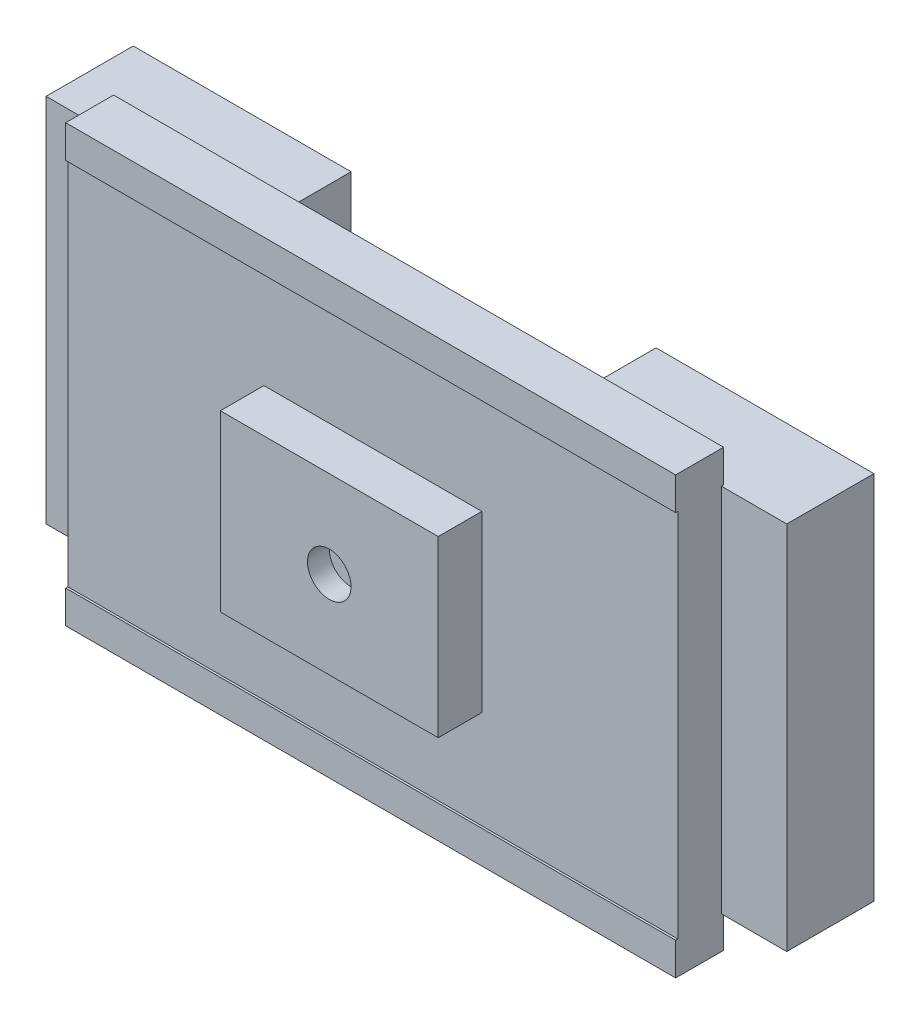
ISO-10303-21;
HEADER;
FILE_DESCRIPTION(('STEP AP214'),'2;1');
FILE_NAME('part.step','',(''),(''),'','','');
FILE_SCHEMA(('AUTOMOTIVE_DESIGN { 1 0 10303 214 1 1 1 1 }'));
ENDSEC;
DATA;
#1=APPLICATION_CONTEXT('core data for automotive mechanical design processes');
#2=APPLICATION_PROTOCOL_DEFINITION('international standard','automotive_design',2000,#1);
#3=PRODUCT_CONTEXT('',#1,'mechanical');
#4=PRODUCT('Part','Part','',(#3));
#5=PRODUCT_RELATED_PRODUCT_CATEGORY('part','',(#4));
#6=PRODUCT_DEFINITION_FORMATION('','',#4);
#7=PRODUCT_DEFINITION_CONTEXT('part definition',#1,'design');
#8=PRODUCT_DEFINITION('design','',#6,#7);
#9=PRODUCT_DEFINITION_SHAPE('','',#8);
#10=(LENGTH_UNIT() NAMED_UNIT(*) SI_UNIT(.MILLI.,.METRE.));
#11=(NAMED_UNIT(*) PLANE_ANGLE_UNIT() SI_UNIT($,.RADIAN.));
#12=(NAMED_UNIT(*) SI_UNIT($,.STERADIAN.) SOLID_ANGLE_UNIT());
#13=UNCERTAINTY_MEASURE_WITH_UNIT(LENGTH_MEASURE(1.E-05),#10,'distance_accuracy_value','');
#14=(GEOMETRIC_REPRESENTATION_CONTEXT(3) GLOBAL_UNCERTAINTY_ASSIGNED_CONTEXT((#13)) GLOBAL_UNIT_ASSIGNED_CONTEXT((#10,
#11,#12)) REPRESENTATION_CONTEXT('',''));
#15=CARTESIAN_POINT('',(0.,0.,0.));
#16=DIRECTION('',(0.,0.,1.));
#17=DIRECTION('',(1.,0.,0.));
#18=AXIS2_PLACEMENT_3D('',#15,#16,#17);
#19=CARTESIAN_POINT('',(0.,0.,0.));
#20=DIRECTION('',(0.,0.,1.));
#21=DIRECTION('',(1.,0.,0.));
#22=AXIS2_PLACEMENT_3D('',#19,#20,#21);
#23=PLANE('',#22);
#24=DIRECTION('',(0.,1.,0.));
#25=VECTOR('',#24,1.);
#26=CARTESIAN_POINT('',(3.5,4.25,0.));
#27=LINE('',#26,#25);
#28=CARTESIAN_POINT('',(3.5,-4.25,0.));
#29=VERTEX_POINT('',#28);
#30=CARTESIAN_POINT('',(3.5,4.25,0.));
#31=VERTEX_POINT('',#30);
#32=EDGE_CURVE('E360',#29,#31,#27,.T.);
#33=ORIENTED_EDGE('',*,*,#32,.F.);
#34=DIRECTION('',(-1.,0.,0.));
#35=VECTOR('',#34,1.);
#36=CARTESIAN_POINT('',(0.,-4.25,0.));
#37=LINE('',#36,#35);
#38=CARTESIAN_POINT('',(-3.5,-4.25,0.));
#39=VERTEX_POINT('',#38);
#40=EDGE_CURVE('E277',#29,#39,#37,.T.);
#41=ORIENTED_EDGE('',*,*,#40,.T.);
#42=DIRECTION('',(0.,-1.,0.));
#43=VECTOR('',#42,1.);
#44=CARTESIAN_POINT('',(-3.5,4.25,0.));
#45=LINE('',#44,#43);
#46=CARTESIAN_POINT('',(-3.5,4.25,0.));
#47=VERTEX_POINT('',#46);
#48=EDGE_CURVE('E421',#47,#39,#45,.T.);
#49=ORIENTED_EDGE('',*,*,#48,.F.);
#50=DIRECTION('',(1.,0.,0.));
#51=VECTOR('',#50,1.);
#52=CARTESIAN_POINT('',(0.,4.25,0.));
#53=LINE('',#52,#51);
#54=EDGE_CURVE('E336',#47,#31,#53,.T.);
#55=ORIENTED_EDGE('',*,*,#54,.T.);
#56=EDGE_LOOP('',(#33,#41,#49,#55));
#57=FACE_BOUND('',#56,.T.);
#58=ADVANCED_FACE('F49',(#57),#23,.F.);
#59=CARTESIAN_POINT('',(0.,0.,1.));
#60=DIRECTION('',(0.,0.,1.));
#61=DIRECTION('',(1.,0.,0.));
#62=AXIS2_PLACEMENT_3D('',#59,#60,#61);
#63=PLANE('',#62);
#64=DIRECTION('',(-1.,0.,0.));
#65=VECTOR('',#64,1.);
#66=CARTESIAN_POINT('',(0.,-4.25,1.));
#67=LINE('',#66,#65);
#68=CARTESIAN_POINT('',(7.,-4.25,1.));
#69=VERTEX_POINT('',#68);
#70=CARTESIAN_POINT('',(-7.,-4.25,1.));
#71=VERTEX_POINT('',#70);
#72=EDGE_CURVE('E65',#69,#71,#67,.T.);
#73=ORIENTED_EDGE('',*,*,#72,.F.);
#74=DIRECTION('',(0.,1.,0.));
#75=VECTOR('',#74,1.);
#76=CARTESIAN_POINT('',(7.,5.,1.));
#77=LINE('',#76,#75);
#78=CARTESIAN_POINT('',(7.,4.25,1.));
#79=VERTEX_POINT('',#78);
#80=EDGE_CURVE('E485',#69,#79,#77,.T.);
#81=ORIENTED_EDGE('',*,*,#80,.T.);
#82=DIRECTION('',(1.,0.,0.));
#83=VECTOR('',#82,1.);
#84=CARTESIAN_POINT('',(0.,4.25,1.));
#85=LINE('',#84,#83);
#86=CARTESIAN_POINT('',(-7.,4.25,1.));
#87=VERTEX_POINT('',#86);
#88=EDGE_CURVE('E340',#87,#79,#85,.T.);
#89=ORIENTED_EDGE('',*,*,#88,.F.);
#90=DIRECTION('',(0.,-1.,0.));
#91=VECTOR('',#90,1.);
#92=CARTESIAN_POINT('',(-7.,5.,1.));
#93=LINE('',#92,#91);
#94=EDGE_CURVE('E70',#87,#71,#93,.T.);
#95=ORIENTED_EDGE('',*,*,#94,.T.);
#96=EDGE_LOOP('',(#73,#81,#89,#95));
#97=FACE_BOUND('',#96,.T.);
#98=DIRECTION('',(1.,0.,0.));
#99=VECTOR('',#98,1.);
#100=CARTESIAN_POINT('',(0.,2.,1.));
#101=LINE('',#100,#99);
#102=CARTESIAN_POINT('',(-2.5,2.,1.));
#103=VERTEX_POINT('',#102);
#104=CARTESIAN_POINT('',(2.5,2.,1.));
#105=VERTEX_POINT('',#104);
#106=EDGE_CURVE('E461',#103,#105,#101,.T.);
#107=ORIENTED_EDGE('',*,*,#106,.T.);
#108=DIRECTION('',(0.,-1.,0.));
#109=VECTOR('',#108,1.);
#110=CARTESIAN_POINT('',(2.5,0.,1.));
#111=LINE('',#110,#109);
#112=CARTESIAN_POINT('',(2.5,-2.,1.));
#113=VERTEX_POINT('',#112);
#114=EDGE_CURVE('E442',#105,#113,#111,.T.);
#115=ORIENTED_EDGE('',*,*,#114,.T.);
#116=DIRECTION('',(1.,0.,0.));
#117=VECTOR('',#116,1.);
#118=CARTESIAN_POINT('',(0.,-2.,1.));
#119=LINE('',#118,#117);
#120=CARTESIAN_POINT('',(-2.5,-2.,1.));
#121=VERTEX_POINT('',#120);
#122=EDGE_CURVE('E448',#121,#113,#119,.T.);
#123=ORIENTED_EDGE('',*,*,#122,.F.);
#124=DIRECTION('',(0.,-1.,0.));
#125=VECTOR('',#124,1.);
#126=CARTESIAN_POINT('',(-2.5,0.,1.));
#127=LINE('',#126,#125);
#128=EDGE_CURVE('E465',#103,#121,#127,.T.);
#129=ORIENTED_EDGE('',*,*,#128,.F.);
#130=EDGE_LOOP('',(#107,#115,#123,#129));
#131=FACE_BOUND('',#130,.T.);
#132=ADVANCED_FACE('F762',(#97,#131),#63,.T.);
#133=CARTESIAN_POINT('',(7.,5.,1.));
#134=DIRECTION('',(-1.,0.,0.));
#135=DIRECTION('',(0.,0.,1.));
#136=AXIS2_PLACEMENT_3D('',#133,#134,#135);
#137=PLANE('',#136);
#138=ORIENTED_EDGE('',*,*,#80,.F.);
#139=DIRECTION('',(0.,0.,-1.));
#140=VECTOR('',#139,1.);
#141=CARTESIAN_POINT('',(6.99999999999999,-4.25,1.05));
#142=LINE('',#141,#140);
#143=CARTESIAN_POINT('',(6.99999999999999,-4.25,1.05));
#144=VERTEX_POINT('',#143);
#145=EDGE_CURVE('E273',#144,#69,#142,.T.);
#146=ORIENTED_EDGE('',*,*,#145,.F.);
#147=DIRECTION('',(0.,-1.,0.));
#148=VECTOR('',#147,1.);
#149=CARTESIAN_POINT('',(6.99999999999999,-5.,1.05));
#150=LINE('',#149,#148);
#151=CARTESIAN_POINT('',(6.99999999999999,-5.,1.05));
#152=VERTEX_POINT('',#151);
#153=EDGE_CURVE('E269',#144,#152,#150,.T.);
#154=ORIENTED_EDGE('',*,*,#153,.T.);
#155=DIRECTION('',(0.,0.,-1.));
#156=VECTOR('',#155,1.);
#157=CARTESIAN_POINT('',(7.,-5.,1.));
#158=LINE('',#157,#156);
#159=CARTESIAN_POINT('',(6.99999999999999,-5.,-0.05));
#160=VERTEX_POINT('',#159);
#161=EDGE_CURVE('E231',#152,#160,#158,.T.);
#162=ORIENTED_EDGE('',*,*,#161,.T.);
#163=DIRECTION('',(0.,-1.,0.));
#164=VECTOR('',#163,1.);
#165=CARTESIAN_POINT('',(6.99999999999999,-5.,-0.05));
#166=LINE('',#165,#164);
#167=CARTESIAN_POINT('',(6.99999999999999,-4.25,-0.05));
#168=VERTEX_POINT('',#167);
#169=EDGE_CURVE('E247',#168,#160,#166,.T.);
#170=ORIENTED_EDGE('',*,*,#169,.F.);
#171=CARTESIAN_POINT('',(6.99999999999999,-4.25,0.));
#172=VERTEX_POINT('',#171);
#173=EDGE_CURVE('E278',#172,#168,#142,.T.);
#174=ORIENTED_EDGE('',*,*,#173,.F.);
#175=DIRECTION('',(0.,1.,0.));
#176=VECTOR('',#175,1.);
#177=CARTESIAN_POINT('',(7.,5.,0.));
#178=LINE('',#177,#176);
#179=CARTESIAN_POINT('',(7.,4.25,0.));
#180=VERTEX_POINT('',#179);
#181=EDGE_CURVE('E484',#172,#180,#178,.T.);
#182=ORIENTED_EDGE('',*,*,#181,.T.);
#183=DIRECTION('',(0.,0.,-1.));
#184=VECTOR('',#183,1.);
#185=CARTESIAN_POINT('',(7.,4.25,1.05));
#186=LINE('',#185,#184);
#187=CARTESIAN_POINT('',(7.,4.25,-0.0499999999999999));
#188=VERTEX_POINT('',#187);
#189=EDGE_CURVE('E325',#180,#188,#186,.T.);
#190=ORIENTED_EDGE('',*,*,#189,.T.);
#191=DIRECTION('',(0.,-1.,0.));
#192=VECTOR('',#191,1.);
#193=CARTESIAN_POINT('',(7.,5.,-0.05));
#194=LINE('',#193,#192);
#195=CARTESIAN_POINT('',(7.,5.,-0.05));
#196=VERTEX_POINT('',#195);
#197=EDGE_CURVE('E300',#196,#188,#194,.T.);
#198=ORIENTED_EDGE('',*,*,#197,.F.);
#199=DIRECTION('',(0.,0.,-1.));
#200=VECTOR('',#199,1.);
#201=CARTESIAN_POINT('',(7.,5.,1.));
#202=LINE('',#201,#200);
#203=CARTESIAN_POINT('',(7.,5.,1.05));
#204=VERTEX_POINT('',#203);
#205=EDGE_CURVE('E11',#204,#196,#202,.T.);
#206=ORIENTED_EDGE('',*,*,#205,.F.);
#207=DIRECTION('',(0.,-1.,0.));
#208=VECTOR('',#207,1.);
#209=CARTESIAN_POINT('',(7.,5.,1.05));
#210=LINE('',#209,#208);
#211=CARTESIAN_POINT('',(7.,4.25,1.05));
#212=VERTEX_POINT('',#211);
#213=EDGE_CURVE('E318',#204,#212,#210,.T.);
#214=ORIENTED_EDGE('',*,*,#213,.T.);
#215=EDGE_CURVE('E332',#212,#79,#186,.T.);
#216=ORIENTED_EDGE('',*,*,#215,.T.);
#217=EDGE_LOOP('',(#138,#146,#154,#162,#170,#174,#182,#190,#198,#206,#214,#216));
#218=FACE_BOUND('',#217,.T.);
#219=ADVANCED_FACE('F51',(#218),#137,.F.);
#220=CARTESIAN_POINT('',(-7.,5.,1.));
#221=DIRECTION('',(0.,-1.,0.));
#222=DIRECTION('',(0.,0.,-1.));
#223=AXIS2_PLACEMENT_3D('',#220,#221,#222);
#224=PLANE('',#223);
#225=ORIENTED_EDGE('',*,*,#205,.T.);
#226=DIRECTION('',(1.,0.,0.));
#227=VECTOR('',#226,1.);
#228=CARTESIAN_POINT('',(7.,5.,-0.05));
#229=LINE('',#228,#227);
#230=CARTESIAN_POINT('',(-7.,5.,-0.05));
#231=VERTEX_POINT('',#230);
#232=EDGE_CURVE('E296',#231,#196,#229,.T.);
#233=ORIENTED_EDGE('',*,*,#232,.F.);
#234=DIRECTION('',(0.,0.,-1.));
#235=VECTOR('',#234,1.);
#236=CARTESIAN_POINT('',(-7.,5.,1.));
#237=LINE('',#236,#235);
#238=CARTESIAN_POINT('',(-7.,5.,1.05));
#239=VERTEX_POINT('',#238);
#240=EDGE_CURVE('E58',#239,#231,#237,.T.);
#241=ORIENTED_EDGE('',*,*,#240,.F.);
#242=DIRECTION('',(1.,0.,0.));
#243=VECTOR('',#242,1.);
#244=CARTESIAN_POINT('',(7.,5.,1.05));
#245=LINE('',#244,#243);
#246=EDGE_CURVE('E314',#239,#204,#245,.T.);
#247=ORIENTED_EDGE('',*,*,#246,.T.);
#248=EDGE_LOOP('',(#225,#233,#241,#247));
#249=FACE_BOUND('',#248,.T.);
#250=ADVANCED_FACE('F506',(#249),#224,.F.);
#251=CARTESIAN_POINT('',(-7.,5.,1.));
#252=DIRECTION('',(1.,0.,0.));
#253=DIRECTION('',(0.,0.,-1.));
#254=AXIS2_PLACEMENT_3D('',#251,#252,#253);
#255=PLANE('',#254);
#256=DIRECTION('',(0.,-1.,0.));
#257=VECTOR('',#256,1.);
#258=CARTESIAN_POINT('',(-7.,5.,0.));
#259=LINE('',#258,#257);
#260=CARTESIAN_POINT('',(-7.,4.25,0.));
#261=VERTEX_POINT('',#260);
#262=CARTESIAN_POINT('',(-6.99999999999999,-4.24999999999999,0.));
#263=VERTEX_POINT('',#262);
#264=EDGE_CURVE('E488',#261,#263,#259,.T.);
#265=ORIENTED_EDGE('',*,*,#264,.T.);
#266=DIRECTION('',(0.,0.,-1.));
#267=VECTOR('',#266,1.);
#268=CARTESIAN_POINT('',(-6.99999999999999,-4.24999999999999,1.05));
#269=LINE('',#268,#267);
#270=CARTESIAN_POINT('',(-6.99999999999999,-4.24999999999999,-0.05));
#271=VERTEX_POINT('',#270);
#272=EDGE_CURVE('E237',#263,#271,#269,.T.);
#273=ORIENTED_EDGE('',*,*,#272,.T.);
#274=DIRECTION('',(0.,1.,0.));
#275=VECTOR('',#274,1.);
#276=CARTESIAN_POINT('',(-7.,-5.,-0.05));
#277=LINE('',#276,#275);
#278=CARTESIAN_POINT('',(-7.,-5.,-0.05));
#279=VERTEX_POINT('',#278);
#280=EDGE_CURVE('E234',#279,#271,#277,.T.);
#281=ORIENTED_EDGE('',*,*,#280,.F.);
#282=DIRECTION('',(0.,0.,-1.));
#283=VECTOR('',#282,1.);
#284=CARTESIAN_POINT('',(-7.,-5.,1.));
#285=LINE('',#284,#283);
#286=CARTESIAN_POINT('',(-7.,-5.,1.05));
#287=VERTEX_POINT('',#286);
#288=EDGE_CURVE('E220',#287,#279,#285,.T.);
#289=ORIENTED_EDGE('',*,*,#288,.F.);
#290=DIRECTION('',(0.,1.,0.));
#291=VECTOR('',#290,1.);
#292=CARTESIAN_POINT('',(-7.,-5.,1.05));
#293=LINE('',#292,#291);
#294=CARTESIAN_POINT('',(-6.99999999999999,-4.24999999999999,1.05));
#295=VERTEX_POINT('',#294);
#296=EDGE_CURVE('E262',#287,#295,#293,.T.);
#297=ORIENTED_EDGE('',*,*,#296,.T.);
#298=EDGE_CURVE('E279',#295,#71,#269,.T.);
#299=ORIENTED_EDGE('',*,*,#298,.T.);
#300=ORIENTED_EDGE('',*,*,#94,.F.);
#301=DIRECTION('',(0.,0.,-1.));
#302=VECTOR('',#301,1.);
#303=CARTESIAN_POINT('',(-7.,4.25,1.05));
#304=LINE('',#303,#302);
#305=CARTESIAN_POINT('',(-7.,4.25,1.05));
#306=VERTEX_POINT('',#305);
#307=EDGE_CURVE('E326',#306,#87,#304,.T.);
#308=ORIENTED_EDGE('',*,*,#307,.F.);
#309=DIRECTION('',(0.,1.,0.));
#310=VECTOR('',#309,1.);
#311=CARTESIAN_POINT('',(-7.,5.,1.05));
#312=LINE('',#311,#310);
#313=EDGE_CURVE('E309',#306,#239,#312,.T.);
#314=ORIENTED_EDGE('',*,*,#313,.T.);
#315=ORIENTED_EDGE('',*,*,#240,.T.);
#316=DIRECTION('',(0.,1.,0.));
#317=VECTOR('',#316,1.);
#318=CARTESIAN_POINT('',(-7.,5.,-0.05));
#319=LINE('',#318,#317);
#320=CARTESIAN_POINT('',(-7.,4.25,-0.0499999999999999));
#321=VERTEX_POINT('',#320);
#322=EDGE_CURVE('E292',#321,#231,#319,.T.);
#323=ORIENTED_EDGE('',*,*,#322,.F.);
#324=EDGE_CURVE('E331',#261,#321,#304,.T.);
#325=ORIENTED_EDGE('',*,*,#324,.F.);
#326=EDGE_LOOP('',(#265,#273,#281,#289,#297,#299,#300,#308,#314,#315,#323,#325));
#327=FACE_BOUND('',#326,.T.);
#328=ADVANCED_FACE('F236',(#327),#255,.F.);
#329=CARTESIAN_POINT('',(-7.,-5.,1.));
#330=DIRECTION('',(0.,1.,0.));
#331=DIRECTION('',(0.,0.,1.));
#332=AXIS2_PLACEMENT_3D('',#329,#330,#331);
#333=PLANE('',#332);
#334=ORIENTED_EDGE('',*,*,#288,.T.);
#335=DIRECTION('',(-1.,0.,0.));
#336=VECTOR('',#335,1.);
#337=CARTESIAN_POINT('',(6.99999999999999,-5.,-0.05));
#338=LINE('',#337,#336);
#339=EDGE_CURVE('E224',#160,#279,#338,.T.);
#340=ORIENTED_EDGE('',*,*,#339,.F.);
#341=ORIENTED_EDGE('',*,*,#161,.F.);
#342=DIRECTION('',(-1.,0.,0.));
#343=VECTOR('',#342,1.);
#344=CARTESIAN_POINT('',(6.99999999999999,-5.,1.05));
#345=LINE('',#344,#343);
#346=EDGE_CURVE('E226',#152,#287,#345,.T.);
#347=ORIENTED_EDGE('',*,*,#346,.T.);
#348=EDGE_LOOP('',(#334,#340,#341,#347));
#349=FACE_BOUND('',#348,.T.);
#350=ADVANCED_FACE('F222',(#349),#333,.F.);
#351=CARTESIAN_POINT('',(2.5,0.,2.));
#352=DIRECTION('',(1.,0.,0.));
#353=DIRECTION('',(0.,0.,-1.));
#354=AXIS2_PLACEMENT_3D('',#351,#352,#353);
#355=PLANE('',#354);
#356=ORIENTED_EDGE('',*,*,#114,.F.);
#357=DIRECTION('',(0.,0.,-1.));
#358=VECTOR('',#357,1.);
#359=CARTESIAN_POINT('',(2.5,2.,2.));
#360=LINE('',#359,#358);
#361=CARTESIAN_POINT('',(2.5,2.,2.));
#362=VERTEX_POINT('',#361);
#363=EDGE_CURVE('E480',#362,#105,#360,.T.);
#364=ORIENTED_EDGE('',*,*,#363,.F.);
#365=DIRECTION('',(0.,-1.,0.));
#366=VECTOR('',#365,1.);
#367=CARTESIAN_POINT('',(2.5,0.,2.));
#368=LINE('',#367,#366);
#369=CARTESIAN_POINT('',(2.5,-2.,2.));
#370=VERTEX_POINT('',#369);
#371=EDGE_CURVE('E443',#362,#370,#368,.T.);
#372=ORIENTED_EDGE('',*,*,#371,.T.);
#373=DIRECTION('',(0.,0.,-1.));
#374=VECTOR('',#373,1.);
#375=CARTESIAN_POINT('',(2.5,-2.,2.));
#376=LINE('',#375,#374);
#377=EDGE_CURVE('E457',#370,#113,#376,.T.);
#378=ORIENTED_EDGE('',*,*,#377,.T.);
#379=EDGE_LOOP('',(#356,#364,#372,#378));
#380=FACE_BOUND('',#379,.T.);
#381=ADVANCED_FACE('F774',(#380),#355,.T.);
#382=CARTESIAN_POINT('',(0.,2.,2.));
#383=DIRECTION('',(0.,1.,0.));
#384=DIRECTION('',(0.,0.,1.));
#385=AXIS2_PLACEMENT_3D('',#382,#383,#384);
#386=PLANE('',#385);
#387=ORIENTED_EDGE('',*,*,#106,.F.);
#388=DIRECTION('',(0.,0.,-1.));
#389=VECTOR('',#388,1.);
#390=CARTESIAN_POINT('',(-2.5,2.,2.));
#391=LINE('',#390,#389);
#392=CARTESIAN_POINT('',(-2.5,2.,2.));
#393=VERTEX_POINT('',#392);
#394=EDGE_CURVE('E477',#393,#103,#391,.T.);
#395=ORIENTED_EDGE('',*,*,#394,.F.);
#396=DIRECTION('',(1.,0.,0.));
#397=VECTOR('',#396,1.);
#398=CARTESIAN_POINT('',(0.,2.,2.));
#399=LINE('',#398,#397);
#400=EDGE_CURVE('E447',#393,#362,#399,.T.);
#401=ORIENTED_EDGE('',*,*,#400,.T.);
#402=ORIENTED_EDGE('',*,*,#363,.T.);
#403=EDGE_LOOP('',(#387,#395,#401,#402));
#404=FACE_BOUND('',#403,.T.);
#405=ADVANCED_FACE('F1097',(#404),#386,.T.);
#406=CARTESIAN_POINT('',(-2.5,0.,2.));
#407=DIRECTION('',(1.,0.,0.));
#408=DIRECTION('',(0.,1.,0.));
#409=AXIS2_PLACEMENT_3D('',#406,#407,#408);
#410=PLANE('',#409);
#411=ORIENTED_EDGE('',*,*,#128,.T.);
#412=DIRECTION('',(0.,0.,-1.));
#413=VECTOR('',#412,1.);
#414=CARTESIAN_POINT('',(-2.5,-2.,2.));
#415=LINE('',#414,#413);
#416=CARTESIAN_POINT('',(-2.5,-2.,2.));
#417=VERTEX_POINT('',#416);
#418=EDGE_CURVE('E473',#417,#121,#415,.T.);
#419=ORIENTED_EDGE('',*,*,#418,.F.);
#420=DIRECTION('',(0.,-1.,0.));
#421=VECTOR('',#420,1.);
#422=CARTESIAN_POINT('',(-2.5,0.,2.));
#423=LINE('',#422,#421);
#424=EDGE_CURVE('E451',#393,#417,#423,.T.);
#425=ORIENTED_EDGE('',*,*,#424,.F.);
#426=ORIENTED_EDGE('',*,*,#394,.T.);
#427=EDGE_LOOP('',(#411,#419,#425,#426));
#428=FACE_BOUND('',#427,.T.);
#429=ADVANCED_FACE('F1088',(#428),#410,.F.);
#430=CARTESIAN_POINT('',(0.,-2.,2.));
#431=DIRECTION('',(0.,1.,0.));
#432=DIRECTION('',(0.,0.,1.));
#433=AXIS2_PLACEMENT_3D('',#430,#431,#432);
#434=PLANE('',#433);
#435=ORIENTED_EDGE('',*,*,#122,.T.);
#436=ORIENTED_EDGE('',*,*,#377,.F.);
#437=DIRECTION('',(1.,0.,0.));
#438=VECTOR('',#437,1.);
#439=CARTESIAN_POINT('',(0.,-2.,2.));
#440=LINE('',#439,#438);
#441=EDGE_CURVE('E454',#417,#370,#440,.T.);
#442=ORIENTED_EDGE('',*,*,#441,.F.);
#443=ORIENTED_EDGE('',*,*,#418,.T.);
#444=EDGE_LOOP('',(#435,#436,#442,#443));
#445=FACE_BOUND('',#444,.T.);
#446=ADVANCED_FACE('F1079',(#445),#434,.F.);
#447=CARTESIAN_POINT('',(0.,0.,2.));
#448=DIRECTION('',(0.,0.,1.));
#449=DIRECTION('',(1.,0.,0.));
#450=AXIS2_PLACEMENT_3D('',#447,#448,#449);
#451=PLANE('',#450);
#452=CARTESIAN_POINT('',(0.,0.,2.));
#453=DIRECTION('',(0.,0.,1.));
#454=DIRECTION('',(1.,0.,0.));
#455=AXIS2_PLACEMENT_3D('',#452,#453,#454);
#456=CIRCLE('',#455,0.5);
#457=CARTESIAN_POINT('',(0.5,0.,2.));
#458=VERTEX_POINT('',#457);
#459=EDGE_CURVE('E346',#458,#458,#456,.T.);
#460=ORIENTED_EDGE('',*,*,#459,.F.);
#461=EDGE_LOOP('',(#460));
#462=FACE_BOUND('',#461,.T.);
#463=ORIENTED_EDGE('',*,*,#371,.F.);
#464=ORIENTED_EDGE('',*,*,#400,.F.);
#465=ORIENTED_EDGE('',*,*,#424,.T.);
#466=ORIENTED_EDGE('',*,*,#441,.T.);
#467=EDGE_LOOP('',(#463,#464,#465,#466));
#468=FACE_BOUND('',#467,.T.);
#469=ADVANCED_FACE('F1070',(#462,#468),#451,.T.);
#470=CARTESIAN_POINT('',(-8.5,4.25,-2.));
#471=DIRECTION('',(1.,0.,0.));
#472=DIRECTION('',(0.,0.,-1.));
#473=AXIS2_PLACEMENT_3D('',#470,#471,#472);
#474=PLANE('',#473);
#475=DIRECTION('',(0.,1.,0.));
#476=VECTOR('',#475,1.);
#477=CARTESIAN_POINT('',(-8.5,4.25,0.));
#478=LINE('',#477,#476);
#479=CARTESIAN_POINT('',(-8.5,-4.25,0.));
#480=VERTEX_POINT('',#479);
#481=CARTESIAN_POINT('',(-8.5,4.25,0.));
#482=VERTEX_POINT('',#481);
#483=EDGE_CURVE('E398',#480,#482,#478,.T.);
#484=ORIENTED_EDGE('',*,*,#483,.T.);
#485=DIRECTION('',(0.,0.,1.));
#486=VECTOR('',#485,1.);
#487=CARTESIAN_POINT('',(-8.5,4.25,-2.));
#488=LINE('',#487,#486);
#489=CARTESIAN_POINT('',(-8.5,4.25,-2.));
#490=VERTEX_POINT('',#489);
#491=EDGE_CURVE('E438',#490,#482,#488,.T.);
#492=ORIENTED_EDGE('',*,*,#491,.F.);
#493=DIRECTION('',(0.,1.,0.));
#494=VECTOR('',#493,1.);
#495=CARTESIAN_POINT('',(-8.5,4.25,-2.));
#496=LINE('',#495,#494);
#497=CARTESIAN_POINT('',(-8.5,-4.25,-2.));
#498=VERTEX_POINT('',#497);
#499=EDGE_CURVE('E399',#498,#490,#496,.T.);
#500=ORIENTED_EDGE('',*,*,#499,.F.);
#501=DIRECTION('',(0.,0.,1.));
#502=VECTOR('',#501,1.);
#503=CARTESIAN_POINT('',(-8.5,-4.25,-2.));
#504=LINE('',#503,#502);
#505=EDGE_CURVE('E413',#498,#480,#504,.T.);
#506=ORIENTED_EDGE('',*,*,#505,.T.);
#507=EDGE_LOOP('',(#484,#492,#500,#506));
#508=FACE_BOUND('',#507,.T.);
#509=ADVANCED_FACE('F851',(#508),#474,.F.);
#510=CARTESIAN_POINT('',(-3.5,4.25,-2.));
#511=DIRECTION('',(0.,-1.,0.));
#512=DIRECTION('',(0.,0.,-1.));
#513=AXIS2_PLACEMENT_3D('',#510,#511,#512);
#514=PLANE('',#513);
#515=DIRECTION('',(1.,0.,0.));
#516=VECTOR('',#515,1.);
#517=CARTESIAN_POINT('',(-3.5,4.25,0.));
#518=LINE('',#517,#516);
#519=EDGE_CURVE('E417',#482,#261,#518,.T.);
#520=ORIENTED_EDGE('',*,*,#519,.T.);
#521=ORIENTED_EDGE('',*,*,#324,.T.);
#522=DIRECTION('',(-1.,0.,0.));
#523=VECTOR('',#522,1.);
#524=CARTESIAN_POINT('',(7.,4.25,-0.05));
#525=LINE('',#524,#523);
#526=CARTESIAN_POINT('',(-3.5,4.25,-0.0500000000000001));
#527=VERTEX_POINT('',#526);
#528=EDGE_CURVE('E304',#527,#321,#525,.T.);
#529=ORIENTED_EDGE('',*,*,#528,.F.);
#530=DIRECTION('',(0.,0.,1.));
#531=VECTOR('',#530,1.);
#532=CARTESIAN_POINT('',(-3.5,4.25,-2.));
#533=LINE('',#532,#531);
#534=CARTESIAN_POINT('',(-3.5,4.25,-2.));
#535=VERTEX_POINT('',#534);
#536=EDGE_CURVE('E434',#535,#527,#533,.T.);
#537=ORIENTED_EDGE('',*,*,#536,.F.);
#538=DIRECTION('',(1.,0.,0.));
#539=VECTOR('',#538,1.);
#540=CARTESIAN_POINT('',(-3.5,4.25,-2.));
#541=LINE('',#540,#539);
#542=EDGE_CURVE('E403',#490,#535,#541,.T.);
#543=ORIENTED_EDGE('',*,*,#542,.F.);
#544=ORIENTED_EDGE('',*,*,#491,.T.);
#545=EDGE_LOOP('',(#520,#521,#529,#537,#543,#544));
#546=FACE_BOUND('',#545,.T.);
#547=ADVANCED_FACE('F844',(#546),#514,.F.);
#548=CARTESIAN_POINT('',(-3.5,4.25,-2.));
#549=DIRECTION('',(-1.,0.,0.));
#550=DIRECTION('',(0.,0.,1.));
#551=AXIS2_PLACEMENT_3D('',#548,#549,#550);
#552=PLANE('',#551);
#553=ORIENTED_EDGE('',*,*,#48,.T.);
#554=DIRECTION('',(0.,0.,-1.));
#555=VECTOR('',#554,1.);
#556=CARTESIAN_POINT('',(-3.5,-4.25,-2.));
#557=LINE('',#556,#555);
#558=CARTESIAN_POINT('',(-3.5,-4.25,-0.05));
#559=VERTEX_POINT('',#558);
#560=EDGE_CURVE('E286',#39,#559,#557,.T.);
#561=ORIENTED_EDGE('',*,*,#560,.T.);
#562=DIRECTION('',(0.,0.,1.));
#563=VECTOR('',#562,1.);
#564=CARTESIAN_POINT('',(-3.5,-4.25,-2.));
#565=LINE('',#564,#563);
#566=CARTESIAN_POINT('',(-3.5,-4.25,-2.));
#567=VERTEX_POINT('',#566);
#568=EDGE_CURVE('E430',#567,#559,#565,.T.);
#569=ORIENTED_EDGE('',*,*,#568,.F.);
#570=DIRECTION('',(0.,-1.,0.));
#571=VECTOR('',#570,1.);
#572=CARTESIAN_POINT('',(-3.5,4.25,-2.));
#573=LINE('',#572,#571);
#574=EDGE_CURVE('E407',#535,#567,#573,.T.);
#575=ORIENTED_EDGE('',*,*,#574,.F.);
#576=ORIENTED_EDGE('',*,*,#536,.T.);
#577=DIRECTION('',(0.,0.,1.));
#578=VECTOR('',#577,1.);
#579=CARTESIAN_POINT('',(-3.5,4.25,-2.));
#580=LINE('',#579,#578);
#581=EDGE_CURVE('E330',#527,#47,#580,.T.);
#582=ORIENTED_EDGE('',*,*,#581,.T.);
#583=EDGE_LOOP('',(#553,#561,#569,#575,#576,#582));
#584=FACE_BOUND('',#583,.T.);
#585=ADVANCED_FACE('F850',(#584),#552,.F.);
#586=CARTESIAN_POINT('',(-3.5,-4.25,-2.));
#587=DIRECTION('',(0.,1.,0.));
#588=DIRECTION('',(0.,0.,1.));
#589=AXIS2_PLACEMENT_3D('',#586,#587,#588);
#590=PLANE('',#589);
#591=DIRECTION('',(1.,0.,0.));
#592=VECTOR('',#591,1.);
#593=CARTESIAN_POINT('',(6.99999999999999,-4.25,-0.05));
#594=LINE('',#593,#592);
#595=EDGE_CURVE('E254',#271,#559,#594,.T.);
#596=ORIENTED_EDGE('',*,*,#595,.F.);
#597=ORIENTED_EDGE('',*,*,#272,.F.);
#598=DIRECTION('',(-1.,0.,0.));
#599=VECTOR('',#598,1.);
#600=CARTESIAN_POINT('',(-3.5,-4.25,0.));
#601=LINE('',#600,#599);
#602=EDGE_CURVE('E404',#263,#480,#601,.T.);
#603=ORIENTED_EDGE('',*,*,#602,.T.);
#604=ORIENTED_EDGE('',*,*,#505,.F.);
#605=DIRECTION('',(-1.,0.,0.));
#606=VECTOR('',#605,1.);
#607=CARTESIAN_POINT('',(-3.5,-4.25,-2.));
#608=LINE('',#607,#606);
#609=EDGE_CURVE('E410',#567,#498,#608,.T.);
#610=ORIENTED_EDGE('',*,*,#609,.F.);
#611=ORIENTED_EDGE('',*,*,#568,.T.);
#612=EDGE_LOOP('',(#596,#597,#603,#604,#610,#611));
#613=FACE_BOUND('',#612,.T.);
#614=ADVANCED_FACE('F863',(#613),#590,.F.);
#615=CARTESIAN_POINT('',(0.,0.,-2.));
#616=DIRECTION('',(0.,0.,-1.));
#617=DIRECTION('',(-1.,0.,0.));
#618=AXIS2_PLACEMENT_3D('',#615,#616,#617);
#619=PLANE('',#618);
#620=ORIENTED_EDGE('',*,*,#499,.T.);
#621=ORIENTED_EDGE('',*,*,#542,.T.);
#622=ORIENTED_EDGE('',*,*,#574,.T.);
#623=ORIENTED_EDGE('',*,*,#609,.T.);
#624=EDGE_LOOP('',(#620,#621,#622,#623));
#625=FACE_BOUND('',#624,.T.);
#626=ADVANCED_FACE('F875',(#625),#619,.T.);
#627=CARTESIAN_POINT('',(0.,0.,0.));
#628=DIRECTION('',(0.,0.,-1.));
#629=DIRECTION('',(-1.,0.,0.));
#630=AXIS2_PLACEMENT_3D('',#627,#628,#629);
#631=PLANE('',#630);
#632=ORIENTED_EDGE('',*,*,#264,.F.);
#633=ORIENTED_EDGE('',*,*,#519,.F.);
#634=ORIENTED_EDGE('',*,*,#483,.F.);
#635=ORIENTED_EDGE('',*,*,#602,.F.);
#636=EDGE_LOOP('',(#632,#633,#634,#635));
#637=FACE_BOUND('',#636,.T.);
#638=ADVANCED_FACE('F884',(#637),#631,.F.);
#639=CARTESIAN_POINT('',(0.,0.,0.));
#640=DIRECTION('',(0.,0.,-1.));
#641=DIRECTION('',(-1.,0.,0.));
#642=AXIS2_PLACEMENT_3D('',#639,#640,#641);
#643=PLANE('',#642);
#644=DIRECTION('',(1.,0.,0.));
#645=VECTOR('',#644,1.);
#646=CARTESIAN_POINT('',(3.5,4.25,0.));
#647=LINE('',#646,#645);
#648=CARTESIAN_POINT('',(8.50000000000001,4.25,0.));
#649=VERTEX_POINT('',#648);
#650=EDGE_CURVE('E351',#180,#649,#647,.T.);
#651=ORIENTED_EDGE('',*,*,#650,.F.);
#652=ORIENTED_EDGE('',*,*,#181,.F.);
#653=DIRECTION('',(-1.,0.,0.));
#654=VECTOR('',#653,1.);
#655=CARTESIAN_POINT('',(3.5,-4.25,0.));
#656=LINE('',#655,#654);
#657=CARTESIAN_POINT('',(8.5,-4.25,0.));
#658=VERTEX_POINT('',#657);
#659=EDGE_CURVE('E375',#658,#172,#656,.T.);
#660=ORIENTED_EDGE('',*,*,#659,.F.);
#661=DIRECTION('',(0.,-1.,0.));
#662=VECTOR('',#661,1.);
#663=CARTESIAN_POINT('',(8.50000000000001,4.25,0.));
#664=LINE('',#663,#662);
#665=EDGE_CURVE('E372',#649,#658,#664,.T.);
#666=ORIENTED_EDGE('',*,*,#665,.F.);
#667=EDGE_LOOP('',(#651,#652,#660,#666));
#668=FACE_BOUND('',#667,.T.);
#669=ADVANCED_FACE('F735',(#668),#643,.F.);
#670=CARTESIAN_POINT('',(3.5,4.25,-2.));
#671=DIRECTION('',(0.,-1.,0.));
#672=DIRECTION('',(0.,0.,-1.));
#673=AXIS2_PLACEMENT_3D('',#670,#671,#672);
#674=PLANE('',#673);
#675=CARTESIAN_POINT('',(3.5,4.25,-0.0500000000000001));
#676=VERTEX_POINT('',#675);
#677=EDGE_CURVE('E305',#188,#676,#525,.T.);
#678=ORIENTED_EDGE('',*,*,#677,.F.);
#679=ORIENTED_EDGE('',*,*,#189,.F.);
#680=ORIENTED_EDGE('',*,*,#650,.T.);
#681=DIRECTION('',(0.,0.,1.));
#682=VECTOR('',#681,1.);
#683=CARTESIAN_POINT('',(8.50000000000001,4.25,-2.));
#684=LINE('',#683,#682);
#685=CARTESIAN_POINT('',(8.50000000000001,4.25,-2.));
#686=VERTEX_POINT('',#685);
#687=EDGE_CURVE('E394',#686,#649,#684,.T.);
#688=ORIENTED_EDGE('',*,*,#687,.F.);
#689=DIRECTION('',(1.,0.,0.));
#690=VECTOR('',#689,1.);
#691=CARTESIAN_POINT('',(3.5,4.25,-2.));
#692=LINE('',#691,#690);
#693=CARTESIAN_POINT('',(3.5,4.25,-2.));
#694=VERTEX_POINT('',#693);
#695=EDGE_CURVE('E355',#694,#686,#692,.T.);
#696=ORIENTED_EDGE('',*,*,#695,.F.);
#697=DIRECTION('',(0.,0.,1.));
#698=VECTOR('',#697,1.);
#699=CARTESIAN_POINT('',(3.5,4.25,-2.));
#700=LINE('',#699,#698);
#701=EDGE_CURVE('E381',#694,#676,#700,.T.);
#702=ORIENTED_EDGE('',*,*,#701,.T.);
#703=EDGE_LOOP('',(#678,#679,#680,#688,#696,#702));
#704=FACE_BOUND('',#703,.T.);
#705=ADVANCED_FACE('F739',(#704),#674,.F.);
#706=CARTESIAN_POINT('',(8.50000000000001,4.25,-2.));
#707=DIRECTION('',(-1.,0.,0.));
#708=DIRECTION('',(0.,-1.,0.));
#709=AXIS2_PLACEMENT_3D('',#706,#707,#708);
#710=PLANE('',#709);
#711=ORIENTED_EDGE('',*,*,#665,.T.);
#712=DIRECTION('',(0.,0.,1.));
#713=VECTOR('',#712,1.);
#714=CARTESIAN_POINT('',(8.5,-4.25,-2.));
#715=LINE('',#714,#713);
#716=CARTESIAN_POINT('',(8.5,-4.25,-2.));
#717=VERTEX_POINT('',#716);
#718=EDGE_CURVE('E390',#717,#658,#715,.T.);
#719=ORIENTED_EDGE('',*,*,#718,.F.);
#720=DIRECTION('',(0.,-1.,0.));
#721=VECTOR('',#720,1.);
#722=CARTESIAN_POINT('',(8.50000000000001,4.25,-2.));
#723=LINE('',#722,#721);
#724=EDGE_CURVE('E359',#686,#717,#723,.T.);
#725=ORIENTED_EDGE('',*,*,#724,.F.);
#726=ORIENTED_EDGE('',*,*,#687,.T.);
#727=EDGE_LOOP('',(#711,#719,#725,#726));
#728=FACE_BOUND('',#727,.T.);
#729=ADVANCED_FACE('F911',(#728),#710,.F.);
#730=CARTESIAN_POINT('',(3.5,-4.25,-2.));
#731=DIRECTION('',(0.,1.,0.));
#732=DIRECTION('',(-1.,0.,0.));
#733=AXIS2_PLACEMENT_3D('',#730,#731,#732);
#734=PLANE('',#733);
#735=ORIENTED_EDGE('',*,*,#659,.T.);
#736=ORIENTED_EDGE('',*,*,#173,.T.);
#737=CARTESIAN_POINT('',(3.5,-4.25,-0.05));
#738=VERTEX_POINT('',#737);
#739=EDGE_CURVE('E242',#738,#168,#594,.T.);
#740=ORIENTED_EDGE('',*,*,#739,.F.);
#741=DIRECTION('',(0.,0.,1.));
#742=VECTOR('',#741,1.);
#743=CARTESIAN_POINT('',(3.5,-4.25,-2.));
#744=LINE('',#743,#742);
#745=CARTESIAN_POINT('',(3.5,-4.25,-2.));
#746=VERTEX_POINT('',#745);
#747=EDGE_CURVE('E386',#746,#738,#744,.T.);
#748=ORIENTED_EDGE('',*,*,#747,.F.);
#749=DIRECTION('',(-1.,0.,0.));
#750=VECTOR('',#749,1.);
#751=CARTESIAN_POINT('',(3.5,-4.25,-2.));
#752=LINE('',#751,#750);
#753=EDGE_CURVE('E363',#717,#746,#752,.T.);
#754=ORIENTED_EDGE('',*,*,#753,.F.);
#755=ORIENTED_EDGE('',*,*,#718,.T.);
#756=EDGE_LOOP('',(#735,#736,#740,#748,#754,#755));
#757=FACE_BOUND('',#756,.T.);
#758=ADVANCED_FACE('F728',(#757),#734,.F.);
#759=CARTESIAN_POINT('',(3.5,4.25,-2.));
#760=DIRECTION('',(1.,0.,0.));
#761=DIRECTION('',(0.,1.,0.));
#762=AXIS2_PLACEMENT_3D('',#759,#760,#761);
#763=PLANE('',#762);
#764=ORIENTED_EDGE('',*,*,#32,.T.);
#765=EDGE_CURVE('E369',#676,#31,#700,.T.);
#766=ORIENTED_EDGE('',*,*,#765,.F.);
#767=ORIENTED_EDGE('',*,*,#701,.F.);
#768=DIRECTION('',(0.,1.,0.));
#769=VECTOR('',#768,1.);
#770=CARTESIAN_POINT('',(3.5,4.25,-2.));
#771=LINE('',#770,#769);
#772=EDGE_CURVE('E366',#746,#694,#771,.T.);
#773=ORIENTED_EDGE('',*,*,#772,.F.);
#774=ORIENTED_EDGE('',*,*,#747,.T.);
#775=EDGE_CURVE('E385',#738,#29,#744,.T.);
#776=ORIENTED_EDGE('',*,*,#775,.T.);
#777=EDGE_LOOP('',(#764,#766,#767,#773,#774,#776));
#778=FACE_BOUND('',#777,.T.);
#779=ADVANCED_FACE('F924',(#778),#763,.F.);
#780=CARTESIAN_POINT('',(0.,0.,-2.));
#781=DIRECTION('',(0.,0.,-1.));
#782=DIRECTION('',(-1.,0.,0.));
#783=AXIS2_PLACEMENT_3D('',#780,#781,#782);
#784=PLANE('',#783);
#785=ORIENTED_EDGE('',*,*,#695,.T.);
#786=ORIENTED_EDGE('',*,*,#724,.T.);
#787=ORIENTED_EDGE('',*,*,#753,.T.);
#788=ORIENTED_EDGE('',*,*,#772,.T.);
#789=EDGE_LOOP('',(#785,#786,#787,#788));
#790=FACE_BOUND('',#789,.T.);
#791=ADVANCED_FACE('F935',(#790),#784,.T.);
#792=CARTESIAN_POINT('',(0.,0.,1.5));
#793=DIRECTION('',(0.,0.,1.));
#794=DIRECTION('',(1.,0.,0.));
#795=AXIS2_PLACEMENT_3D('',#792,#793,#794);
#796=CYLINDRICAL_SURFACE('',#795,0.5);
#797=CARTESIAN_POINT('',(0.,0.,1.5));
#798=DIRECTION('',(0.,0.,1.));
#799=DIRECTION('',(1.,0.,0.));
#800=AXIS2_PLACEMENT_3D('',#797,#798,#799);
#801=CIRCLE('',#800,0.5);
#802=CARTESIAN_POINT('',(0.5,0.,1.5));
#803=VERTEX_POINT('',#802);
#804=EDGE_CURVE('E347',#803,#803,#801,.T.);
#805=ORIENTED_EDGE('',*,*,#804,.F.);
#806=EDGE_LOOP('',(#805));
#807=FACE_BOUND('',#806,.T.);
#808=ORIENTED_EDGE('',*,*,#459,.T.);
#809=EDGE_LOOP('',(#808));
#810=FACE_BOUND('',#809,.T.);
#811=ADVANCED_FACE('F1027',(#807,#810),#796,.F.);
#812=CARTESIAN_POINT('',(0.,0.,1.5));
#813=DIRECTION('',(0.,0.,1.));
#814=DIRECTION('',(1.,0.,0.));
#815=AXIS2_PLACEMENT_3D('',#812,#813,#814);
#816=PLANE('',#815);
#817=ORIENTED_EDGE('',*,*,#804,.T.);
#818=EDGE_LOOP('',(#817));
#819=FACE_BOUND('',#818,.T.);
#820=ADVANCED_FACE('F798',(#819),#816,.T.);
#821=CARTESIAN_POINT('',(7.,4.25,1.05));
#822=DIRECTION('',(0.,-1.,0.));
#823=DIRECTION('',(0.,0.,-1.));
#824=AXIS2_PLACEMENT_3D('',#821,#822,#823);
#825=PLANE('',#824);
#826=ORIENTED_EDGE('',*,*,#54,.F.);
#827=ORIENTED_EDGE('',*,*,#581,.F.);
#828=EDGE_CURVE('E310',#676,#527,#525,.T.);
#829=ORIENTED_EDGE('',*,*,#828,.F.);
#830=ORIENTED_EDGE('',*,*,#765,.T.);
#831=EDGE_LOOP('',(#826,#827,#829,#830));
#832=FACE_BOUND('',#831,.T.);
#833=ADVANCED_FACE('F944',(#832),#825,.T.);
#834=CARTESIAN_POINT('',(0.,0.,-0.05));
#835=DIRECTION('',(0.,0.,-1.));
#836=DIRECTION('',(-1.,0.,0.));
#837=AXIS2_PLACEMENT_3D('',#834,#835,#836);
#838=PLANE('',#837);
#839=ORIENTED_EDGE('',*,*,#322,.T.);
#840=ORIENTED_EDGE('',*,*,#232,.T.);
#841=ORIENTED_EDGE('',*,*,#197,.T.);
#842=ORIENTED_EDGE('',*,*,#677,.T.);
#843=ORIENTED_EDGE('',*,*,#828,.T.);
#844=ORIENTED_EDGE('',*,*,#528,.T.);
#845=EDGE_LOOP('',(#839,#840,#841,#842,#843,#844));
#846=FACE_BOUND('',#845,.T.);
#847=ADVANCED_FACE('F510',(#846),#838,.T.);
#848=ORIENTED_EDGE('',*,*,#307,.T.);
#849=ORIENTED_EDGE('',*,*,#88,.T.);
#850=ORIENTED_EDGE('',*,*,#215,.F.);
#851=DIRECTION('',(-1.,0.,0.));
#852=VECTOR('',#851,1.);
#853=CARTESIAN_POINT('',(7.,4.25,1.05));
#854=LINE('',#853,#852);
#855=EDGE_CURVE('E321',#212,#306,#854,.T.);
#856=ORIENTED_EDGE('',*,*,#855,.T.);
#857=EDGE_LOOP('',(#848,#849,#850,#856));
#858=FACE_BOUND('',#857,.T.);
#859=ADVANCED_FACE('F746',(#858),#825,.T.);
#860=CARTESIAN_POINT('',(0.,0.,1.05));
#861=DIRECTION('',(0.,0.,-1.));
#862=DIRECTION('',(-1.,0.,0.));
#863=AXIS2_PLACEMENT_3D('',#860,#861,#862);
#864=PLANE('',#863);
#865=ORIENTED_EDGE('',*,*,#313,.F.);
#866=ORIENTED_EDGE('',*,*,#855,.F.);
#867=ORIENTED_EDGE('',*,*,#213,.F.);
#868=ORIENTED_EDGE('',*,*,#246,.F.);
#869=EDGE_LOOP('',(#865,#866,#867,#868));
#870=FACE_BOUND('',#869,.T.);
#871=ADVANCED_FACE('F744',(#870),#864,.F.);
#872=CARTESIAN_POINT('',(6.99999999999999,-4.25,1.05));
#873=DIRECTION('',(0.,1.,0.));
#874=DIRECTION('',(-1.,0.,0.));
#875=AXIS2_PLACEMENT_3D('',#872,#873,#874);
#876=PLANE('',#875);
#877=ORIENTED_EDGE('',*,*,#560,.F.);
#878=ORIENTED_EDGE('',*,*,#40,.F.);
#879=ORIENTED_EDGE('',*,*,#775,.F.);
#880=EDGE_CURVE('E257',#559,#738,#594,.T.);
#881=ORIENTED_EDGE('',*,*,#880,.F.);
#882=EDGE_LOOP('',(#877,#878,#879,#881));
#883=FACE_BOUND('',#882,.T.);
#884=ADVANCED_FACE('F759',(#883),#876,.T.);
#885=CARTESIAN_POINT('',(0.,0.,-0.05));
#886=DIRECTION('',(0.,0.,-1.));
#887=DIRECTION('',(-1.,0.,0.));
#888=AXIS2_PLACEMENT_3D('',#885,#886,#887);
#889=PLANE('',#888);
#890=ORIENTED_EDGE('',*,*,#339,.T.);
#891=ORIENTED_EDGE('',*,*,#280,.T.);
#892=ORIENTED_EDGE('',*,*,#595,.T.);
#893=ORIENTED_EDGE('',*,*,#880,.T.);
#894=ORIENTED_EDGE('',*,*,#739,.T.);
#895=ORIENTED_EDGE('',*,*,#169,.T.);
#896=EDGE_LOOP('',(#890,#891,#892,#893,#894,#895));
#897=FACE_BOUND('',#896,.T.);
#898=ADVANCED_FACE('F245',(#897),#889,.T.);
#899=ORIENTED_EDGE('',*,*,#145,.T.);
#900=ORIENTED_EDGE('',*,*,#72,.T.);
#901=ORIENTED_EDGE('',*,*,#298,.F.);
#902=DIRECTION('',(1.,0.,0.));
#903=VECTOR('',#902,1.);
#904=CARTESIAN_POINT('',(6.99999999999999,-4.25,1.05));
#905=LINE('',#904,#903);
#906=EDGE_CURVE('E265',#295,#144,#905,.T.);
#907=ORIENTED_EDGE('',*,*,#906,.T.);
#908=EDGE_LOOP('',(#899,#900,#901,#907));
#909=FACE_BOUND('',#908,.T.);
#910=ADVANCED_FACE('F748',(#909),#876,.T.);
#911=CARTESIAN_POINT('',(0.,0.,1.05));
#912=DIRECTION('',(0.,0.,-1.));
#913=DIRECTION('',(-1.,0.,0.));
#914=AXIS2_PLACEMENT_3D('',#911,#912,#913);
#915=PLANE('',#914);
#916=ORIENTED_EDGE('',*,*,#346,.F.);
#917=ORIENTED_EDGE('',*,*,#153,.F.);
#918=ORIENTED_EDGE('',*,*,#906,.F.);
#919=ORIENTED_EDGE('',*,*,#296,.F.);
#920=EDGE_LOOP('',(#916,#917,#918,#919));
#921=FACE_BOUND('',#920,.T.);
#922=ADVANCED_FACE('F752',(#921),#915,.F.);
#923=CLOSED_SHELL('',(#58,#132,#219,#250,#328,#350,#381,#405,#429,#446,#469,#509,#547,#585,#614,
#626,#638,#669,#705,#729,#758,#779,#791,#811,#820,#833,#847,#859,#871,#884,#898,#910,#922));
#924=MANIFOLD_SOLID_BREP('B2',#923);
#925=ADVANCED_BREP_SHAPE_REPRESENTATION('',(#18,#924),#14);
#926=SHAPE_DEFINITION_REPRESENTATION(#9,#925);
ENDSEC;
END-ISO-10303-21;
